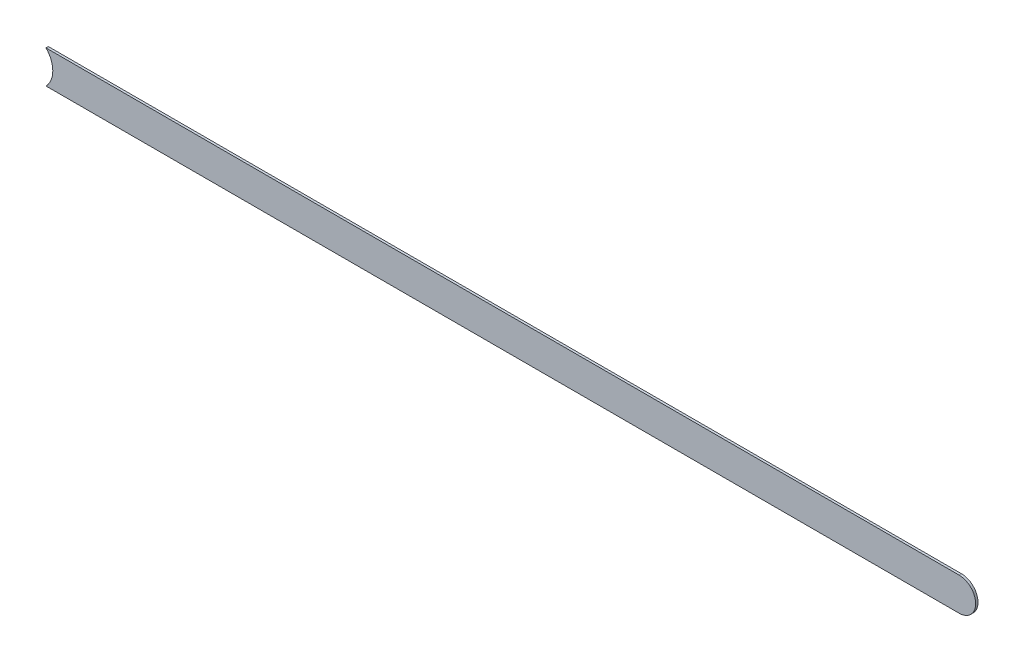
ISO-10303-21;
HEADER;
FILE_DESCRIPTION(('STEP AP214'),'2;1');
FILE_NAME('part.step','',(''),(''),'','','');
FILE_SCHEMA(('AUTOMOTIVE_DESIGN { 1 0 10303 214 1 1 1 1 }'));
ENDSEC;
DATA;
#1=APPLICATION_CONTEXT('core data for automotive mechanical design processes');
#2=APPLICATION_PROTOCOL_DEFINITION('international standard','automotive_design',2000,#1);
#3=PRODUCT_CONTEXT('',#1,'mechanical');
#4=PRODUCT('Part','Part','',(#3));
#5=PRODUCT_RELATED_PRODUCT_CATEGORY('part','',(#4));
#6=PRODUCT_DEFINITION_FORMATION('','',#4);
#7=PRODUCT_DEFINITION_CONTEXT('part definition',#1,'design');
#8=PRODUCT_DEFINITION('design','',#6,#7);
#9=PRODUCT_DEFINITION_SHAPE('','',#8);
#10=(LENGTH_UNIT() NAMED_UNIT(*) SI_UNIT(.MILLI.,.METRE.));
#11=(NAMED_UNIT(*) PLANE_ANGLE_UNIT() SI_UNIT($,.RADIAN.));
#12=(NAMED_UNIT(*) SI_UNIT($,.STERADIAN.) SOLID_ANGLE_UNIT());
#13=UNCERTAINTY_MEASURE_WITH_UNIT(LENGTH_MEASURE(1.E-05),#10,'distance_accuracy_value','');
#14=(GEOMETRIC_REPRESENTATION_CONTEXT(3) GLOBAL_UNCERTAINTY_ASSIGNED_CONTEXT((#13)) GLOBAL_UNIT_ASSIGNED_CONTEXT((#10,
#11,#12)) REPRESENTATION_CONTEXT('',''));
#15=CARTESIAN_POINT('',(0.,0.,0.));
#16=DIRECTION('',(0.,0.,1.));
#17=DIRECTION('',(1.,0.,0.));
#18=AXIS2_PLACEMENT_3D('',#15,#16,#17);
#19=CARTESIAN_POINT('',(54.1528854355931,71.24999974,0.));
#20=DIRECTION('',(0.,1.,0.));
#21=DIRECTION('',(1.,0.,0.));
#22=AXIS2_PLACEMENT_3D('',#19,#20,#21);
#23=PLANE('',#22);
#24=DIRECTION('',(1.,0.,0.));
#25=VECTOR('',#24,1.);
#26=CARTESIAN_POINT('',(53.89999888,71.24999974,0.03556));
#27=LINE('',#26,#25);
#28=CARTESIAN_POINT('',(54.1528854355931,71.24999974,0.03556));
#29=VERTEX_POINT('',#28);
#30=CARTESIAN_POINT('',(67.97140076,71.24999974,0.03556));
#31=VERTEX_POINT('',#30);
#32=EDGE_CURVE('E11',#29,#31,#27,.T.);
#33=ORIENTED_EDGE('',*,*,#32,.F.);
#34=DIRECTION('',(0.,0.,1.));
#35=VECTOR('',#34,1.);
#36=CARTESIAN_POINT('',(54.1528854355931,71.24999974,0.));
#37=LINE('',#36,#35);
#38=CARTESIAN_POINT('',(54.1528854355931,71.24999974,0.));
#39=VERTEX_POINT('',#38);
#40=EDGE_CURVE('E24',#39,#29,#37,.T.);
#41=ORIENTED_EDGE('',*,*,#40,.F.);
#42=DIRECTION('',(1.,0.,0.));
#43=VECTOR('',#42,1.);
#44=CARTESIAN_POINT('',(53.89999888,71.24999974,0.));
#45=LINE('',#44,#43);
#46=CARTESIAN_POINT('',(67.97140076,71.24999974,0.));
#47=VERTEX_POINT('',#46);
#48=EDGE_CURVE('E82',#39,#47,#45,.T.);
#49=ORIENTED_EDGE('',*,*,#48,.T.);
#50=DIRECTION('',(0.,0.,1.));
#51=VECTOR('',#50,1.);
#52=CARTESIAN_POINT('',(67.97140076,71.24999974,0.));
#53=LINE('',#52,#51);
#54=EDGE_CURVE('E37',#47,#31,#53,.T.);
#55=ORIENTED_EDGE('',*,*,#54,.T.);
#56=EDGE_LOOP('',(#33,#41,#49,#55));
#57=FACE_BOUND('',#56,.T.);
#58=ADVANCED_FACE('F17',(#57),#23,.F.);
#59=CARTESIAN_POINT('',(67.97140076,71.49999924,0.));
#60=DIRECTION('',(0.,0.,-1.));
#61=DIRECTION('',(0.,-1.,0.));
#62=AXIS2_PLACEMENT_3D('',#59,#60,#61);
#63=CYLINDRICAL_SURFACE('',#62,0.249999500000001);
#64=CARTESIAN_POINT('',(67.97140076,71.49999924,0.03556));
#65=DIRECTION('',(0.,0.,1.));
#66=DIRECTION('',(0.,-1.,0.));
#67=AXIS2_PLACEMENT_3D('',#64,#65,#66);
#68=CIRCLE('',#67,0.249999500000001);
#69=CARTESIAN_POINT('',(67.97140076,71.74999874,0.03556));
#70=VERTEX_POINT('',#69);
#71=EDGE_CURVE('E97',#31,#70,#68,.T.);
#72=ORIENTED_EDGE('',*,*,#71,.F.);
#73=ORIENTED_EDGE('',*,*,#54,.F.);
#74=CARTESIAN_POINT('',(67.97140076,71.49999924,0.));
#75=DIRECTION('',(0.,0.,1.));
#76=DIRECTION('',(0.,-1.,0.));
#77=AXIS2_PLACEMENT_3D('',#74,#75,#76);
#78=CIRCLE('',#77,0.249999500000001);
#79=CARTESIAN_POINT('',(67.97140076,71.74999874,0.));
#80=VERTEX_POINT('',#79);
#81=EDGE_CURVE('E94',#47,#80,#78,.T.);
#82=ORIENTED_EDGE('',*,*,#81,.T.);
#83=DIRECTION('',(0.,0.,1.));
#84=VECTOR('',#83,1.);
#85=CARTESIAN_POINT('',(67.97140076,71.74999874,0.));
#86=LINE('',#85,#84);
#87=EDGE_CURVE('E92',#80,#70,#86,.T.);
#88=ORIENTED_EDGE('',*,*,#87,.T.);
#89=EDGE_LOOP('',(#72,#73,#82,#88));
#90=FACE_BOUND('',#89,.T.);
#91=ADVANCED_FACE('F103',(#90),#63,.T.);
#92=CARTESIAN_POINT('',(67.97140076,71.74999874,0.));
#93=DIRECTION('',(0.,-1.,0.));
#94=DIRECTION('',(-1.,0.,0.));
#95=AXIS2_PLACEMENT_3D('',#92,#93,#94);
#96=PLANE('',#95);
#97=DIRECTION('',(-1.,0.,0.));
#98=VECTOR('',#97,1.);
#99=CARTESIAN_POINT('',(67.97140076,71.74999874,0.03556));
#100=LINE('',#99,#98);
#101=CARTESIAN_POINT('',(54.1528854355931,71.74999874,0.03556));
#102=VERTEX_POINT('',#101);
#103=EDGE_CURVE('E89',#70,#102,#100,.T.);
#104=ORIENTED_EDGE('',*,*,#103,.F.);
#105=ORIENTED_EDGE('',*,*,#87,.F.);
#106=DIRECTION('',(-1.,0.,0.));
#107=VECTOR('',#106,1.);
#108=CARTESIAN_POINT('',(67.97140076,71.74999874,0.));
#109=LINE('',#108,#107);
#110=CARTESIAN_POINT('',(54.1528854355931,71.74999874,0.));
#111=VERTEX_POINT('',#110);
#112=EDGE_CURVE('E87',#80,#111,#109,.T.);
#113=ORIENTED_EDGE('',*,*,#112,.T.);
#114=DIRECTION('',(0.,0.,1.));
#115=VECTOR('',#114,1.);
#116=CARTESIAN_POINT('',(54.1528854355931,71.74999874,0.));
#117=LINE('',#116,#115);
#118=EDGE_CURVE('E69',#111,#102,#117,.T.);
#119=ORIENTED_EDGE('',*,*,#118,.T.);
#120=EDGE_LOOP('',(#104,#105,#113,#119));
#121=FACE_BOUND('',#120,.T.);
#122=ADVANCED_FACE('F108',(#121),#96,.F.);
#123=CARTESIAN_POINT('',(53.89999888,71.49999924,0.));
#124=DIRECTION('',(0.,0.,-1.));
#125=DIRECTION('',(1.,0.,0.));
#126=AXIS2_PLACEMENT_3D('',#123,#124,#125);
#127=CYLINDRICAL_SURFACE('',#126,0.3556);
#128=DIRECTION('',(0.,0.,1.));
#129=VECTOR('',#128,1.);
#130=CARTESIAN_POINT('',(54.25559888,71.49999924,0.));
#131=LINE('',#130,#129);
#132=CARTESIAN_POINT('',(54.25559888,71.49999924,0.));
#133=VERTEX_POINT('',#132);
#134=CARTESIAN_POINT('',(54.25559888,71.49999924,0.03556));
#135=VERTEX_POINT('',#134);
#136=EDGE_CURVE('E59',#133,#135,#131,.T.);
#137=ORIENTED_EDGE('',*,*,#136,.T.);
#138=CARTESIAN_POINT('',(53.89999888,71.49999924,0.03556));
#139=DIRECTION('',(0.,0.,1.));
#140=DIRECTION('',(1.,0.,0.));
#141=AXIS2_PLACEMENT_3D('',#138,#139,#140);
#142=CIRCLE('',#141,0.3556);
#143=EDGE_CURVE('E70',#135,#102,#142,.T.);
#144=ORIENTED_EDGE('',*,*,#143,.T.);
#145=ORIENTED_EDGE('',*,*,#118,.F.);
#146=CARTESIAN_POINT('',(53.89999888,71.49999924,0.));
#147=DIRECTION('',(0.,0.,1.));
#148=DIRECTION('',(1.,0.,0.));
#149=AXIS2_PLACEMENT_3D('',#146,#147,#148);
#150=CIRCLE('',#149,0.3556);
#151=EDGE_CURVE('E73',#133,#111,#150,.T.);
#152=ORIENTED_EDGE('',*,*,#151,.F.);
#153=EDGE_LOOP('',(#137,#144,#145,#152));
#154=FACE_BOUND('',#153,.T.);
#155=ADVANCED_FACE('F74',(#154),#127,.F.);
#156=CARTESIAN_POINT('',(53.89999888,71.49999924,0.));
#157=DIRECTION('',(0.,0.,-1.));
#158=DIRECTION('',(1.,0.,0.));
#159=AXIS2_PLACEMENT_3D('',#156,#157,#158);
#160=CYLINDRICAL_SURFACE('',#159,0.3556);
#161=ORIENTED_EDGE('',*,*,#40,.T.);
#162=CARTESIAN_POINT('',(53.89999888,71.49999924,0.03556));
#163=DIRECTION('',(0.,0.,1.));
#164=DIRECTION('',(1.,0.,0.));
#165=AXIS2_PLACEMENT_3D('',#162,#163,#164);
#166=CIRCLE('',#165,0.3556);
#167=EDGE_CURVE('E65',#29,#135,#166,.T.);
#168=ORIENTED_EDGE('',*,*,#167,.T.);
#169=ORIENTED_EDGE('',*,*,#136,.F.);
#170=EDGE_CURVE('E63',#39,#133,#150,.T.);
#171=ORIENTED_EDGE('',*,*,#170,.F.);
#172=EDGE_LOOP('',(#161,#168,#169,#171));
#173=FACE_BOUND('',#172,.T.);
#174=ADVANCED_FACE('F61',(#173),#160,.F.);
#175=CARTESIAN_POINT('',(53.89999888,71.24999974,0.));
#176=DIRECTION('',(0.,0.,-1.));
#177=DIRECTION('',(-1.,0.,0.));
#178=AXIS2_PLACEMENT_3D('',#175,#176,#177);
#179=PLANE('',#178);
#180=ORIENTED_EDGE('',*,*,#48,.F.);
#181=ORIENTED_EDGE('',*,*,#170,.T.);
#182=ORIENTED_EDGE('',*,*,#151,.T.);
#183=ORIENTED_EDGE('',*,*,#112,.F.);
#184=ORIENTED_EDGE('',*,*,#81,.F.);
#185=EDGE_LOOP('',(#180,#181,#182,#183,#184));
#186=FACE_BOUND('',#185,.T.);
#187=ADVANCED_FACE('F80',(#186),#179,.T.);
#188=CARTESIAN_POINT('',(53.89999888,71.24999974,0.03556));
#189=DIRECTION('',(0.,0.,-1.));
#190=DIRECTION('',(-1.,0.,0.));
#191=AXIS2_PLACEMENT_3D('',#188,#189,#190);
#192=PLANE('',#191);
#193=ORIENTED_EDGE('',*,*,#167,.F.);
#194=ORIENTED_EDGE('',*,*,#32,.T.);
#195=ORIENTED_EDGE('',*,*,#71,.T.);
#196=ORIENTED_EDGE('',*,*,#103,.T.);
#197=ORIENTED_EDGE('',*,*,#143,.F.);
#198=EDGE_LOOP('',(#193,#194,#195,#196,#197));
#199=FACE_BOUND('',#198,.T.);
#200=ADVANCED_FACE('F106',(#199),#192,.F.);
#201=CLOSED_SHELL('',(#58,#91,#122,#155,#174,#187,#200));
#202=MANIFOLD_SOLID_BREP('B1',#201);
#203=ADVANCED_BREP_SHAPE_REPRESENTATION('',(#18,#202),#14);
#204=SHAPE_DEFINITION_REPRESENTATION(#9,#203);
ENDSEC;
END-ISO-10303-21;
